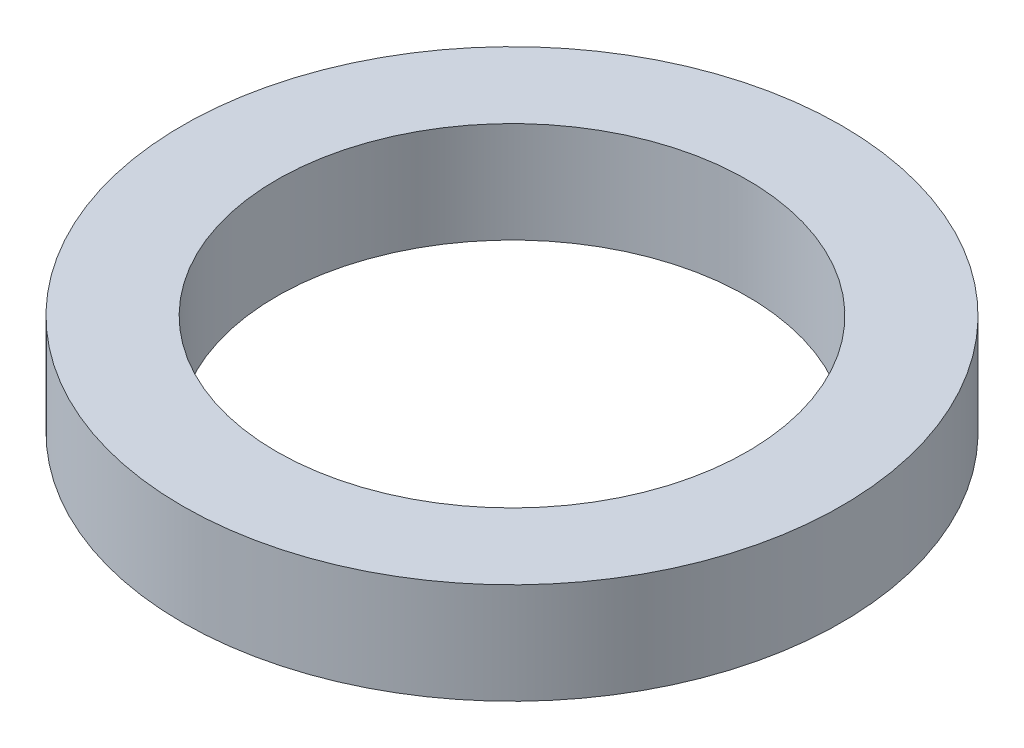
ISO-10303-21;
HEADER;
FILE_DESCRIPTION(('STEP AP214'),'2;1');
FILE_NAME('part.step','',(''),(''),'','','');
FILE_SCHEMA(('AUTOMOTIVE_DESIGN { 1 0 10303 214 1 1 1 1 }'));
ENDSEC;
DATA;
#1=APPLICATION_CONTEXT('core data for automotive mechanical design processes');
#2=APPLICATION_PROTOCOL_DEFINITION('international standard','automotive_design',2000,#1);
#3=PRODUCT_CONTEXT('',#1,'mechanical');
#4=PRODUCT('Part','Part','',(#3));
#5=PRODUCT_RELATED_PRODUCT_CATEGORY('part','',(#4));
#6=PRODUCT_DEFINITION_FORMATION('','',#4);
#7=PRODUCT_DEFINITION_CONTEXT('part definition',#1,'design');
#8=PRODUCT_DEFINITION('design','',#6,#7);
#9=PRODUCT_DEFINITION_SHAPE('','',#8);
#10=(LENGTH_UNIT() NAMED_UNIT(*) SI_UNIT(.MILLI.,.METRE.));
#11=(NAMED_UNIT(*) PLANE_ANGLE_UNIT() SI_UNIT($,.RADIAN.));
#12=(NAMED_UNIT(*) SI_UNIT($,.STERADIAN.) SOLID_ANGLE_UNIT());
#13=UNCERTAINTY_MEASURE_WITH_UNIT(LENGTH_MEASURE(1.E-05),#10,'distance_accuracy_value','');
#14=(GEOMETRIC_REPRESENTATION_CONTEXT(3) GLOBAL_UNCERTAINTY_ASSIGNED_CONTEXT((#13)) GLOBAL_UNIT_ASSIGNED_CONTEXT((#10,
#11,#12)) REPRESENTATION_CONTEXT('',''));
#15=CARTESIAN_POINT('',(0.,0.,0.));
#16=DIRECTION('',(0.,0.,1.));
#17=DIRECTION('',(1.,0.,0.));
#18=AXIS2_PLACEMENT_3D('',#15,#16,#17);
#19=CARTESIAN_POINT('',(0.,1.5,0.));
#20=DIRECTION('',(0.,1.,0.));
#21=DIRECTION('',(0.,0.,1.));
#22=AXIS2_PLACEMENT_3D('',#19,#20,#21);
#23=PLANE('',#22);
#24=CARTESIAN_POINT('',(0.,1.5,0.));
#25=DIRECTION('',(0.,1.,0.));
#26=DIRECTION('',(0.,0.,1.));
#27=AXIS2_PLACEMENT_3D('',#24,#25,#26);
#28=CIRCLE('',#27,4.9);
#29=CARTESIAN_POINT('',(0.,1.5,4.9));
#30=VERTEX_POINT('',#29);
#31=EDGE_CURVE('E10',#30,#30,#28,.T.);
#32=ORIENTED_EDGE('',*,*,#31,.T.);
#33=EDGE_LOOP('',(#32));
#34=FACE_BOUND('',#33,.T.);
#35=CARTESIAN_POINT('',(0.,1.5,0.));
#36=DIRECTION('',(0.,1.,0.));
#37=DIRECTION('',(0.,0.,1.));
#38=AXIS2_PLACEMENT_3D('',#35,#36,#37);
#39=CIRCLE('',#38,3.5);
#40=CARTESIAN_POINT('',(0.,1.5,3.5));
#41=VERTEX_POINT('',#40);
#42=EDGE_CURVE('E51',#41,#41,#39,.T.);
#43=ORIENTED_EDGE('',*,*,#42,.F.);
#44=EDGE_LOOP('',(#43));
#45=FACE_BOUND('',#44,.T.);
#46=ADVANCED_FACE('F37',(#34,#45),#23,.T.);
#47=CARTESIAN_POINT('',(0.,0.,0.));
#48=DIRECTION('',(0.,1.,0.));
#49=DIRECTION('',(0.,0.,1.));
#50=AXIS2_PLACEMENT_3D('',#47,#48,#49);
#51=PLANE('',#50);
#52=CARTESIAN_POINT('',(0.,0.,0.));
#53=DIRECTION('',(0.,1.,0.));
#54=DIRECTION('',(0.,0.,1.));
#55=AXIS2_PLACEMENT_3D('',#52,#53,#54);
#56=CIRCLE('',#55,4.9);
#57=CARTESIAN_POINT('',(0.,0.,4.9));
#58=VERTEX_POINT('',#57);
#59=EDGE_CURVE('E41',#58,#58,#56,.T.);
#60=ORIENTED_EDGE('',*,*,#59,.F.);
#61=EDGE_LOOP('',(#60));
#62=FACE_BOUND('',#61,.T.);
#63=CARTESIAN_POINT('',(0.,0.,0.));
#64=DIRECTION('',(0.,1.,0.));
#65=DIRECTION('',(0.,0.,1.));
#66=AXIS2_PLACEMENT_3D('',#63,#64,#65);
#67=CIRCLE('',#66,3.5);
#68=CARTESIAN_POINT('',(0.,0.,3.5));
#69=VERTEX_POINT('',#68);
#70=EDGE_CURVE('E53',#69,#69,#67,.T.);
#71=ORIENTED_EDGE('',*,*,#70,.T.);
#72=EDGE_LOOP('',(#71));
#73=FACE_BOUND('',#72,.T.);
#74=ADVANCED_FACE('F64',(#62,#73),#51,.F.);
#75=CARTESIAN_POINT('',(0.,1.5,0.));
#76=DIRECTION('',(0.,-1.,0.));
#77=DIRECTION('',(0.,0.,-1.));
#78=AXIS2_PLACEMENT_3D('',#75,#76,#77);
#79=CYLINDRICAL_SURFACE('',#78,4.9);
#80=ORIENTED_EDGE('',*,*,#31,.F.);
#81=EDGE_LOOP('',(#80));
#82=FACE_BOUND('',#81,.T.);
#83=ORIENTED_EDGE('',*,*,#59,.T.);
#84=EDGE_LOOP('',(#83));
#85=FACE_BOUND('',#84,.T.);
#86=ADVANCED_FACE('F39',(#82,#85),#79,.T.);
#87=CARTESIAN_POINT('',(0.,1.5,0.));
#88=DIRECTION('',(0.,-1.,0.));
#89=DIRECTION('',(0.,0.,-1.));
#90=AXIS2_PLACEMENT_3D('',#87,#88,#89);
#91=CYLINDRICAL_SURFACE('',#90,3.5);
#92=ORIENTED_EDGE('',*,*,#42,.T.);
#93=EDGE_LOOP('',(#92));
#94=FACE_BOUND('',#93,.T.);
#95=ORIENTED_EDGE('',*,*,#70,.F.);
#96=EDGE_LOOP('',(#95));
#97=FACE_BOUND('',#96,.T.);
#98=ADVANCED_FACE('F60',(#94,#97),#91,.F.);
#99=CLOSED_SHELL('',(#46,#74,#86,#98));
#100=MANIFOLD_SOLID_BREP('B2',#99);
#101=ADVANCED_BREP_SHAPE_REPRESENTATION('',(#18,#100),#14);
#102=SHAPE_DEFINITION_REPRESENTATION(#9,#101);
ENDSEC;
END-ISO-10303-21;
